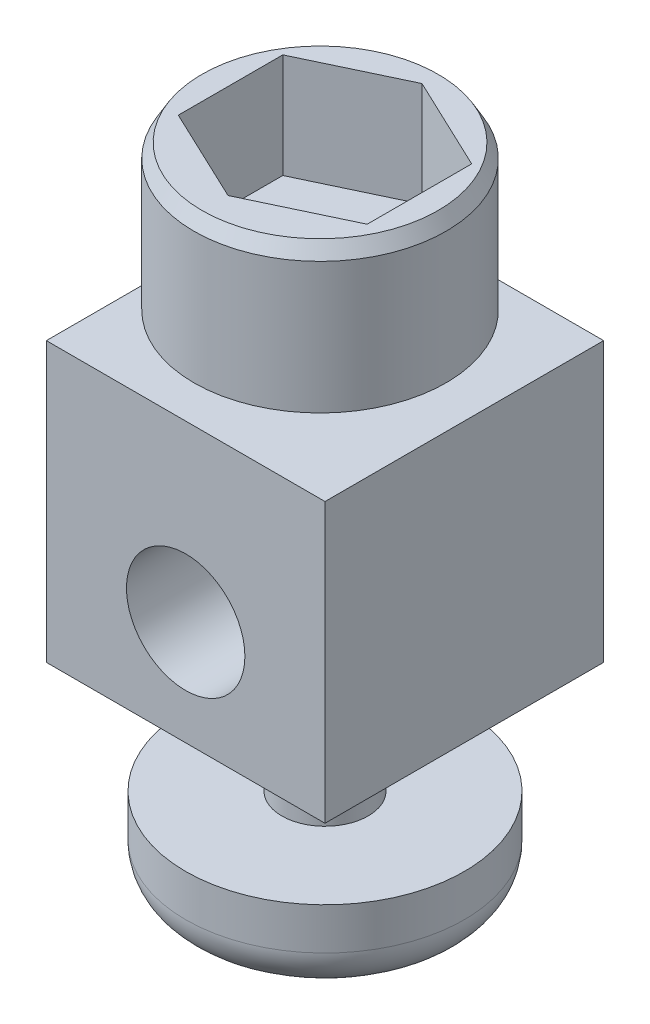
ISO-10303-21;
HEADER;
FILE_DESCRIPTION(('STEP AP214'),'2;1');
FILE_NAME('part.step','',(''),(''),'','','');
FILE_SCHEMA(('AUTOMOTIVE_DESIGN { 1 0 10303 214 1 1 1 1 }'));
ENDSEC;
DATA;
#1=APPLICATION_CONTEXT('core data for automotive mechanical design processes');
#2=APPLICATION_PROTOCOL_DEFINITION('international standard','automotive_design',2000,#1);
#3=PRODUCT_CONTEXT('',#1,'mechanical');
#4=PRODUCT('Part','Part','',(#3));
#5=PRODUCT_RELATED_PRODUCT_CATEGORY('part','',(#4));
#6=PRODUCT_DEFINITION_FORMATION('','',#4);
#7=PRODUCT_DEFINITION_CONTEXT('part definition',#1,'design');
#8=PRODUCT_DEFINITION('design','',#6,#7);
#9=PRODUCT_DEFINITION_SHAPE('','',#8);
#10=(LENGTH_UNIT() NAMED_UNIT(*) SI_UNIT(.MILLI.,.METRE.));
#11=(NAMED_UNIT(*) PLANE_ANGLE_UNIT() SI_UNIT($,.RADIAN.));
#12=(NAMED_UNIT(*) SI_UNIT($,.STERADIAN.) SOLID_ANGLE_UNIT());
#13=UNCERTAINTY_MEASURE_WITH_UNIT(LENGTH_MEASURE(1.E-05),#10,'distance_accuracy_value','');
#14=(GEOMETRIC_REPRESENTATION_CONTEXT(3) GLOBAL_UNCERTAINTY_ASSIGNED_CONTEXT((#13)) GLOBAL_UNIT_ASSIGNED_CONTEXT((#10,
#11,#12)) REPRESENTATION_CONTEXT('',''));
#15=CARTESIAN_POINT('',(0.,0.,0.));
#16=DIRECTION('',(0.,0.,1.));
#17=DIRECTION('',(1.,0.,0.));
#18=AXIS2_PLACEMENT_3D('',#15,#16,#17);
#19=CARTESIAN_POINT('',(0.,-6.5532,2.54));
#20=DIRECTION('',(0.,1.,0.));
#21=DIRECTION('',(-1.,0.,0.));
#22=AXIS2_PLACEMENT_3D('',#19,#20,#21);
#23=CYLINDRICAL_SURFACE('',#22,0.7874);
#24=CARTESIAN_POINT('',(0.,-4.57142455943335,2.54));
#25=DIRECTION('',(0.,1.,0.));
#26=DIRECTION('',(0.,0.,1.));
#27=AXIS2_PLACEMENT_3D('',#24,#25,#26);
#28=CIRCLE('',#27,0.7874);
#29=CARTESIAN_POINT('',(0.,-4.57142455943335,3.3274));
#30=VERTEX_POINT('',#29);
#31=EDGE_CURVE('E39',#30,#30,#28,.T.);
#32=ORIENTED_EDGE('',*,*,#31,.T.);
#33=EDGE_LOOP('',(#32));
#34=FACE_BOUND('',#33,.T.);
#35=CARTESIAN_POINT('',(0.,-2.54,2.54));
#36=DIRECTION('',(0.,1.,0.));
#37=DIRECTION('',(-1.,0.,0.));
#38=AXIS2_PLACEMENT_3D('',#35,#36,#37);
#39=CIRCLE('',#38,0.7874);
#40=CARTESIAN_POINT('',(-0.7874,-2.54,2.54));
#41=VERTEX_POINT('',#40);
#42=EDGE_CURVE('E183',#41,#41,#39,.F.);
#43=ORIENTED_EDGE('',*,*,#42,.T.);
#44=EDGE_LOOP('',(#43));
#45=FACE_BOUND('',#44,.T.);
#46=ADVANCED_FACE('F35',(#34,#45),#23,.T.);
#47=CARTESIAN_POINT('',(0.,5.715,2.63019473081329));
#48=DIRECTION('',(0.,1.,0.));
#49=DIRECTION('',(0.,0.,1.));
#50=AXIS2_PLACEMENT_3D('',#47,#48,#49);
#51=PLANE('',#50);
#52=CARTESIAN_POINT('',(0.,5.715,2.63019473081329));
#53=DIRECTION('',(0.,1.,0.));
#54=DIRECTION('',(0.,0.,1.));
#55=AXIS2_PLACEMENT_3D('',#52,#53,#54);
#56=CIRCLE('',#55,2.15205303162583);
#57=CARTESIAN_POINT('',(0.,5.715,4.78224776243912));
#58=VERTEX_POINT('',#57);
#59=EDGE_CURVE('E192',#58,#58,#56,.T.);
#60=ORIENTED_EDGE('',*,*,#59,.T.);
#61=EDGE_LOOP('',(#60));
#62=FACE_BOUND('',#61,.T.);
#63=DIRECTION('',(-0.00014525916845939,0.,0.999999989449887));
#64=VECTOR('',#63,1.);
#65=CARTESIAN_POINT('',(-1.72148007027149,5.715,1.58779210005618));
#66=LINE('',#65,#64);
#67=CARTESIAN_POINT('',(-1.72148007027149,5.715,1.58779210005618));
#68=VERTEX_POINT('',#67);
#69=CARTESIAN_POINT('',(-1.7217567889874,5.715,3.49279207995818));
#70=VERTEX_POINT('',#69);
#71=EDGE_CURVE('E140',#68,#70,#66,.T.);
#72=ORIENTED_EDGE('',*,*,#71,.F.);
#73=DIRECTION('',(0.90366407888267,0.,-0.428242025655045));
#74=VECTOR('',#73,1.);
#75=CARTESIAN_POINT('',(-1.72148007027149,5.715,1.58779210005618));
#76=LINE('',#75,#74);
#77=CARTESIAN_POINT('',(0.,5.715,0.771991041183319));
#78=VERTEX_POINT('',#77);
#79=EDGE_CURVE('E52',#68,#78,#76,.T.);
#80=ORIENTED_EDGE('',*,*,#79,.T.);
#81=DIRECTION('',(0.903736726890933,0.,0.428088692292221));
#82=VECTOR('',#81,1.);
#83=CARTESIAN_POINT('',(0.,5.715,0.771991041183319));
#84=LINE('',#83,#82);
#85=CARTESIAN_POINT('',(1.72161846472723,5.715,1.5875));
#86=VERTEX_POINT('',#85);
#87=EDGE_CURVE('E144',#78,#86,#84,.T.);
#88=ORIENTED_EDGE('',*,*,#87,.T.);
#89=DIRECTION('',(0.,0.,1.));
#90=VECTOR('',#89,1.);
#91=CARTESIAN_POINT('',(1.72161846472723,5.715,1.5875));
#92=LINE('',#91,#90);
#93=CARTESIAN_POINT('',(1.72161846472723,5.715,3.4925));
#94=VERTEX_POINT('',#93);
#95=EDGE_CURVE('E225',#86,#94,#92,.T.);
#96=ORIENTED_EDGE('',*,*,#95,.T.);
#97=DIRECTION('',(0.903736726890933,0.,-0.428088692292221));
#98=VECTOR('',#97,1.);
#99=CARTESIAN_POINT('',(0.,5.715,4.30800895881668));
#100=LINE('',#99,#98);
#101=CARTESIAN_POINT('',(0.,5.715,4.30800895881668));
#102=VERTEX_POINT('',#101);
#103=EDGE_CURVE('E228',#102,#94,#100,.T.);
#104=ORIENTED_EDGE('',*,*,#103,.F.);
#105=DIRECTION('',(0.903809338051129,0.,0.427935369479527));
#106=VECTOR('',#105,1.);
#107=CARTESIAN_POINT('',(-1.7217567889874,5.715,3.49279207995818));
#108=LINE('',#107,#106);
#109=EDGE_CURVE('E231',#70,#102,#108,.T.);
#110=ORIENTED_EDGE('',*,*,#109,.F.);
#111=EDGE_LOOP('',(#72,#80,#88,#96,#104,#110));
#112=FACE_BOUND('',#111,.T.);
#113=ADVANCED_FACE('F251',(#62,#112),#51,.T.);
#114=CARTESIAN_POINT('',(0.,5.715,2.63019473081329));
#115=DIRECTION('',(0.,-1.,0.));
#116=DIRECTION('',(0.,0.,-1.));
#117=AXIS2_PLACEMENT_3D('',#114,#115,#116);
#118=CYLINDRICAL_SURFACE('',#117,1.3716);
#119=CARTESIAN_POINT('',(0.,2.54,2.63019473081329));
#120=DIRECTION('',(0.,-1.,0.));
#121=DIRECTION('',(0.,0.,-1.));
#122=AXIS2_PLACEMENT_3D('',#119,#120,#121);
#123=CIRCLE('',#122,1.3716);
#124=CARTESIAN_POINT('',(0.,2.54,1.25859473081329));
#125=VERTEX_POINT('',#124);
#126=EDGE_CURVE('E186',#125,#125,#123,.F.);
#127=ORIENTED_EDGE('',*,*,#126,.T.);
#128=EDGE_LOOP('',(#127));
#129=FACE_BOUND('',#128,.T.);
#130=CARTESIAN_POINT('',(0.,2.921,2.63019473081329));
#131=DIRECTION('',(0.,1.,0.));
#132=DIRECTION('',(0.,0.,1.));
#133=AXIS2_PLACEMENT_3D('',#130,#131,#132);
#134=CIRCLE('',#133,1.3716);
#135=CARTESIAN_POINT('',(0.,2.921,4.00179473081329));
#136=VERTEX_POINT('',#135);
#137=EDGE_CURVE('E189',#136,#136,#134,.T.);
#138=ORIENTED_EDGE('',*,*,#137,.F.);
#139=EDGE_LOOP('',(#138));
#140=FACE_BOUND('',#139,.T.);
#141=ADVANCED_FACE('F272',(#129,#140),#118,.T.);
#142=CARTESIAN_POINT('',(2.54,2.54,5.08));
#143=DIRECTION('',(0.,-1.,0.));
#144=DIRECTION('',(0.,0.,-1.));
#145=AXIS2_PLACEMENT_3D('',#142,#143,#144);
#146=PLANE('',#145);
#147=DIRECTION('',(-1.,0.,0.));
#148=VECTOR('',#147,1.);
#149=CARTESIAN_POINT('',(2.54,2.54,0.));
#150=LINE('',#149,#148);
#151=CARTESIAN_POINT('',(2.54,2.54,0.));
#152=VERTEX_POINT('',#151);
#153=CARTESIAN_POINT('',(-2.54,2.54,0.));
#154=VERTEX_POINT('',#153);
#155=EDGE_CURVE('E172',#152,#154,#150,.T.);
#156=ORIENTED_EDGE('',*,*,#155,.T.);
#157=DIRECTION('',(0.,0.,-1.));
#158=VECTOR('',#157,1.);
#159=CARTESIAN_POINT('',(-2.54,2.54,5.08));
#160=LINE('',#159,#158);
#161=CARTESIAN_POINT('',(-2.54,2.54,5.08));
#162=VERTEX_POINT('',#161);
#163=EDGE_CURVE('E176',#162,#154,#160,.T.);
#164=ORIENTED_EDGE('',*,*,#163,.F.);
#165=DIRECTION('',(-1.,0.,0.));
#166=VECTOR('',#165,1.);
#167=CARTESIAN_POINT('',(2.54,2.54,5.08));
#168=LINE('',#167,#166);
#169=CARTESIAN_POINT('',(2.54,2.54,5.08));
#170=VERTEX_POINT('',#169);
#171=EDGE_CURVE('E164',#170,#162,#168,.T.);
#172=ORIENTED_EDGE('',*,*,#171,.F.);
#173=DIRECTION('',(0.,0.,-1.));
#174=VECTOR('',#173,1.);
#175=CARTESIAN_POINT('',(2.54,2.54,5.08));
#176=LINE('',#175,#174);
#177=EDGE_CURVE('E178',#170,#152,#176,.T.);
#178=ORIENTED_EDGE('',*,*,#177,.T.);
#179=EDGE_LOOP('',(#156,#164,#172,#178));
#180=FACE_BOUND('',#179,.T.);
#181=ORIENTED_EDGE('',*,*,#126,.F.);
#182=EDGE_LOOP('',(#181));
#183=FACE_BOUND('',#182,.T.);
#184=ADVANCED_FACE('F295',(#180,#183),#146,.F.);
#185=CARTESIAN_POINT('',(-2.54,-2.54,5.08));
#186=DIRECTION('',(0.,1.,0.));
#187=DIRECTION('',(-1.,0.,0.));
#188=AXIS2_PLACEMENT_3D('',#185,#186,#187);
#189=PLANE('',#188);
#190=DIRECTION('',(1.,0.,0.));
#191=VECTOR('',#190,1.);
#192=CARTESIAN_POINT('',(-2.54,-2.54,0.));
#193=LINE('',#192,#191);
#194=CARTESIAN_POINT('',(-2.54,-2.54,0.));
#195=VERTEX_POINT('',#194);
#196=CARTESIAN_POINT('',(2.54,-2.54,0.));
#197=VERTEX_POINT('',#196);
#198=EDGE_CURVE('E158',#195,#197,#193,.T.);
#199=ORIENTED_EDGE('',*,*,#198,.T.);
#200=DIRECTION('',(0.,0.,-1.));
#201=VECTOR('',#200,1.);
#202=CARTESIAN_POINT('',(2.54,-2.54,5.08));
#203=LINE('',#202,#201);
#204=CARTESIAN_POINT('',(2.54,-2.54,5.08));
#205=VERTEX_POINT('',#204);
#206=EDGE_CURVE('E181',#205,#197,#203,.T.);
#207=ORIENTED_EDGE('',*,*,#206,.F.);
#208=DIRECTION('',(1.,0.,0.));
#209=VECTOR('',#208,1.);
#210=CARTESIAN_POINT('',(-2.54,-2.54,5.08));
#211=LINE('',#210,#209);
#212=CARTESIAN_POINT('',(-2.54,-2.54,5.08));
#213=VERTEX_POINT('',#212);
#214=EDGE_CURVE('E161',#213,#205,#211,.T.);
#215=ORIENTED_EDGE('',*,*,#214,.F.);
#216=DIRECTION('',(0.,0.,-1.));
#217=VECTOR('',#216,1.);
#218=CARTESIAN_POINT('',(-2.54,-2.54,5.08));
#219=LINE('',#218,#217);
#220=EDGE_CURVE('E167',#213,#195,#219,.T.);
#221=ORIENTED_EDGE('',*,*,#220,.T.);
#222=EDGE_LOOP('',(#199,#207,#215,#221));
#223=FACE_BOUND('',#222,.T.);
#224=ORIENTED_EDGE('',*,*,#42,.F.);
#225=EDGE_LOOP('',(#224));
#226=FACE_BOUND('',#225,.T.);
#227=ADVANCED_FACE('F471',(#223,#226),#189,.F.);
#228=CARTESIAN_POINT('',(2.54,-2.54,5.08));
#229=DIRECTION('',(-1.,0.,0.));
#230=DIRECTION('',(0.,-1.,0.));
#231=AXIS2_PLACEMENT_3D('',#228,#229,#230);
#232=PLANE('',#231);
#233=DIRECTION('',(0.,1.,0.));
#234=VECTOR('',#233,1.);
#235=CARTESIAN_POINT('',(2.54,-2.54,0.));
#236=LINE('',#235,#234);
#237=EDGE_CURVE('E170',#197,#152,#236,.T.);
#238=ORIENTED_EDGE('',*,*,#237,.T.);
#239=ORIENTED_EDGE('',*,*,#177,.F.);
#240=DIRECTION('',(0.,1.,0.));
#241=VECTOR('',#240,1.);
#242=CARTESIAN_POINT('',(2.54,-2.54,5.08));
#243=LINE('',#242,#241);
#244=EDGE_CURVE('E90',#205,#170,#243,.T.);
#245=ORIENTED_EDGE('',*,*,#244,.F.);
#246=ORIENTED_EDGE('',*,*,#206,.T.);
#247=EDGE_LOOP('',(#238,#239,#245,#246));
#248=FACE_BOUND('',#247,.T.);
#249=ADVANCED_FACE('F486',(#248),#232,.F.);
#250=CARTESIAN_POINT('',(-2.54,2.54,5.08));
#251=DIRECTION('',(1.,0.,0.));
#252=DIRECTION('',(0.,1.,0.));
#253=AXIS2_PLACEMENT_3D('',#250,#251,#252);
#254=PLANE('',#253);
#255=DIRECTION('',(0.,-1.,0.));
#256=VECTOR('',#255,1.);
#257=CARTESIAN_POINT('',(-2.54,2.54,0.));
#258=LINE('',#257,#256);
#259=EDGE_CURVE('E82',#154,#195,#258,.T.);
#260=ORIENTED_EDGE('',*,*,#259,.T.);
#261=ORIENTED_EDGE('',*,*,#220,.F.);
#262=DIRECTION('',(0.,-1.,0.));
#263=VECTOR('',#262,1.);
#264=CARTESIAN_POINT('',(-2.54,2.54,5.08));
#265=LINE('',#264,#263);
#266=EDGE_CURVE('E61',#162,#213,#265,.T.);
#267=ORIENTED_EDGE('',*,*,#266,.F.);
#268=ORIENTED_EDGE('',*,*,#163,.T.);
#269=EDGE_LOOP('',(#260,#261,#267,#268));
#270=FACE_BOUND('',#269,.T.);
#271=ADVANCED_FACE('F518',(#270),#254,.F.);
#272=CARTESIAN_POINT('',(-2.54,-2.54,5.08));
#273=DIRECTION('',(0.,0.,-1.));
#274=DIRECTION('',(-1.,0.,0.));
#275=AXIS2_PLACEMENT_3D('',#272,#273,#274);
#276=PLANE('',#275);
#277=CARTESIAN_POINT('',(0.,-0.635,5.08));
#278=DIRECTION('',(0.,0.,1.));
#279=DIRECTION('',(1.,0.,0.));
#280=AXIS2_PLACEMENT_3D('',#277,#278,#279);
#281=CIRCLE('',#280,1.0795);
#282=CARTESIAN_POINT('',(1.0795,-0.635,5.08));
#283=VERTEX_POINT('',#282);
#284=EDGE_CURVE('E149',#283,#283,#281,.T.);
#285=ORIENTED_EDGE('',*,*,#284,.F.);
#286=EDGE_LOOP('',(#285));
#287=FACE_BOUND('',#286,.T.);
#288=ORIENTED_EDGE('',*,*,#214,.T.);
#289=ORIENTED_EDGE('',*,*,#244,.T.);
#290=ORIENTED_EDGE('',*,*,#171,.T.);
#291=ORIENTED_EDGE('',*,*,#266,.T.);
#292=EDGE_LOOP('',(#288,#289,#290,#291));
#293=FACE_BOUND('',#292,.T.);
#294=ADVANCED_FACE('F508',(#287,#293),#276,.F.);
#295=CARTESIAN_POINT('',(-2.54,-2.54,0.));
#296=DIRECTION('',(0.,0.,-1.));
#297=DIRECTION('',(-1.,0.,0.));
#298=AXIS2_PLACEMENT_3D('',#295,#296,#297);
#299=PLANE('',#298);
#300=CARTESIAN_POINT('',(0.,-0.635,0.));
#301=DIRECTION('',(0.,0.,1.));
#302=DIRECTION('',(1.,0.,0.));
#303=AXIS2_PLACEMENT_3D('',#300,#301,#302);
#304=CIRCLE('',#303,1.0795);
#305=CARTESIAN_POINT('',(1.0795,-0.635,0.));
#306=VERTEX_POINT('',#305);
#307=EDGE_CURVE('E155',#306,#306,#304,.T.);
#308=ORIENTED_EDGE('',*,*,#307,.T.);
#309=EDGE_LOOP('',(#308));
#310=FACE_BOUND('',#309,.T.);
#311=ORIENTED_EDGE('',*,*,#198,.F.);
#312=ORIENTED_EDGE('',*,*,#259,.F.);
#313=ORIENTED_EDGE('',*,*,#155,.F.);
#314=ORIENTED_EDGE('',*,*,#237,.F.);
#315=EDGE_LOOP('',(#311,#312,#313,#314));
#316=FACE_BOUND('',#315,.T.);
#317=ADVANCED_FACE('F497',(#310,#316),#299,.T.);
#318=CARTESIAN_POINT('',(0.,-0.635,0.));
#319=DIRECTION('',(0.,0.,1.));
#320=DIRECTION('',(1.,0.,0.));
#321=AXIS2_PLACEMENT_3D('',#318,#319,#320);
#322=CYLINDRICAL_SURFACE('',#321,1.0795);
#323=ORIENTED_EDGE('',*,*,#307,.F.);
#324=EDGE_LOOP('',(#323));
#325=FACE_BOUND('',#324,.T.);
#326=ORIENTED_EDGE('',*,*,#284,.T.);
#327=EDGE_LOOP('',(#326));
#328=FACE_BOUND('',#327,.T.);
#329=ADVANCED_FACE('F306',(#325,#328),#322,.F.);
#330=CARTESIAN_POINT('',(0.,2.921,2.63019473081329));
#331=DIRECTION('',(0.,1.,0.));
#332=DIRECTION('',(0.,0.,1.));
#333=AXIS2_PLACEMENT_3D('',#330,#331,#332);
#334=PLANE('',#333);
#335=CARTESIAN_POINT('',(0.,2.921,2.63019473081329));
#336=DIRECTION('',(0.,1.,0.));
#337=DIRECTION('',(0.,0.,1.));
#338=AXIS2_PLACEMENT_3D('',#335,#336,#337);
#339=CIRCLE('',#338,2.0447);
#340=CARTESIAN_POINT('',(0.,2.921,4.67489473081328));
#341=VERTEX_POINT('',#340);
#342=EDGE_CURVE('E11',#341,#341,#339,.F.);
#343=ORIENTED_EDGE('',*,*,#342,.T.);
#344=EDGE_LOOP('',(#343));
#345=FACE_BOUND('',#344,.T.);
#346=ORIENTED_EDGE('',*,*,#137,.T.);
#347=EDGE_LOOP('',(#346));
#348=FACE_BOUND('',#347,.T.);
#349=ADVANCED_FACE('F302',(#345,#348),#334,.F.);
#350=CARTESIAN_POINT('',(0.,2.921,2.63019473081329));
#351=DIRECTION('',(0.,1.,0.));
#352=DIRECTION('',(0.,0.,1.));
#353=AXIS2_PLACEMENT_3D('',#350,#351,#352);
#354=CYLINDRICAL_SURFACE('',#353,2.2987);
#355=CARTESIAN_POINT('',(0.,3.06764696837417,2.63019473081329));
#356=DIRECTION('',(0.,1.,0.));
#357=DIRECTION('',(0.,0.,1.));
#358=AXIS2_PLACEMENT_3D('',#355,#356,#357);
#359=CIRCLE('',#358,2.2987);
#360=CARTESIAN_POINT('',(0.,3.06764696837417,4.92889473081329));
#361=VERTEX_POINT('',#360);
#362=EDGE_CURVE('E44',#361,#361,#359,.T.);
#363=ORIENTED_EDGE('',*,*,#362,.T.);
#364=EDGE_LOOP('',(#363));
#365=FACE_BOUND('',#364,.T.);
#366=CARTESIAN_POINT('',(0.,5.461,2.63019473081329));
#367=DIRECTION('',(0.,1.,0.));
#368=DIRECTION('',(0.,0.,1.));
#369=AXIS2_PLACEMENT_3D('',#366,#367,#368);
#370=CIRCLE('',#369,2.2987);
#371=CARTESIAN_POINT('',(0.,5.461,4.92889473081329));
#372=VERTEX_POINT('',#371);
#373=EDGE_CURVE('E195',#372,#372,#370,.F.);
#374=ORIENTED_EDGE('',*,*,#373,.T.);
#375=EDGE_LOOP('',(#374));
#376=FACE_BOUND('',#375,.T.);
#377=ADVANCED_FACE('F298',(#365,#376),#354,.T.);
#378=CARTESIAN_POINT('',(0.,5.715,2.63019473081329));
#379=DIRECTION('',(0.,-1.,0.));
#380=DIRECTION('',(0.,0.,-1.));
#381=AXIS2_PLACEMENT_3D('',#378,#379,#380);
#382=CONICAL_SURFACE('',#381,2.15205303162583,0.523598775598296);
#383=ORIENTED_EDGE('',*,*,#373,.F.);
#384=EDGE_LOOP('',(#383));
#385=FACE_BOUND('',#384,.T.);
#386=ORIENTED_EDGE('',*,*,#59,.F.);
#387=EDGE_LOOP('',(#386));
#388=FACE_BOUND('',#387,.T.);
#389=ADVANCED_FACE('F301',(#385,#388),#382,.T.);
#390=CARTESIAN_POINT('',(-1.72148007027149,3.81,1.58779210005618));
#391=DIRECTION('',(0.428242025655045,0.,0.90366407888267));
#392=DIRECTION('',(0.90366407888267,0.,-0.428242025655045));
#393=AXIS2_PLACEMENT_3D('',#390,#391,#392);
#394=PLANE('',#393);
#395=ORIENTED_EDGE('',*,*,#79,.F.);
#396=DIRECTION('',(0.,1.,0.));
#397=VECTOR('',#396,1.);
#398=CARTESIAN_POINT('',(-1.72148007027149,3.81,1.58779210005618));
#399=LINE('',#398,#397);
#400=CARTESIAN_POINT('',(-1.72148007027149,3.81,1.58779210005618));
#401=VERTEX_POINT('',#400);
#402=EDGE_CURVE('E139',#401,#68,#399,.T.);
#403=ORIENTED_EDGE('',*,*,#402,.F.);
#404=DIRECTION('',(0.90366407888267,0.,-0.428242025655045));
#405=VECTOR('',#404,1.);
#406=CARTESIAN_POINT('',(-1.72148007027149,3.81,1.58779210005618));
#407=LINE('',#406,#405);
#408=CARTESIAN_POINT('',(0.,3.81,0.771991041183319));
#409=VERTEX_POINT('',#408);
#410=EDGE_CURVE('E129',#401,#409,#407,.T.);
#411=ORIENTED_EDGE('',*,*,#410,.T.);
#412=DIRECTION('',(0.,1.,0.));
#413=VECTOR('',#412,1.);
#414=CARTESIAN_POINT('',(0.,3.81,0.771991041183319));
#415=LINE('',#414,#413);
#416=EDGE_CURVE('E138',#409,#78,#415,.T.);
#417=ORIENTED_EDGE('',*,*,#416,.T.);
#418=EDGE_LOOP('',(#395,#403,#411,#417));
#419=FACE_BOUND('',#418,.T.);
#420=ADVANCED_FACE('F137',(#419),#394,.T.);
#421=CARTESIAN_POINT('',(0.,3.81,0.771991041183319));
#422=DIRECTION('',(-0.428088692292221,0.,0.903736726890933));
#423=DIRECTION('',(0.903736726890933,0.,0.428088692292221));
#424=AXIS2_PLACEMENT_3D('',#421,#422,#423);
#425=PLANE('',#424);
#426=ORIENTED_EDGE('',*,*,#87,.F.);
#427=ORIENTED_EDGE('',*,*,#416,.F.);
#428=DIRECTION('',(0.903736726890933,0.,0.428088692292221));
#429=VECTOR('',#428,1.);
#430=CARTESIAN_POINT('',(0.,3.81,0.771991041183319));
#431=LINE('',#430,#429);
#432=CARTESIAN_POINT('',(1.72161846472723,3.81,1.5875));
#433=VERTEX_POINT('',#432);
#434=EDGE_CURVE('E125',#409,#433,#431,.T.);
#435=ORIENTED_EDGE('',*,*,#434,.T.);
#436=DIRECTION('',(0.,1.,0.));
#437=VECTOR('',#436,1.);
#438=CARTESIAN_POINT('',(1.72161846472723,3.81,1.5875));
#439=LINE('',#438,#437);
#440=EDGE_CURVE('E146',#433,#86,#439,.T.);
#441=ORIENTED_EDGE('',*,*,#440,.T.);
#442=EDGE_LOOP('',(#426,#427,#435,#441));
#443=FACE_BOUND('',#442,.T.);
#444=ADVANCED_FACE('F142',(#443),#425,.T.);
#445=CARTESIAN_POINT('',(1.72161846472723,3.81,1.5875));
#446=DIRECTION('',(-1.,0.,0.));
#447=DIRECTION('',(0.,0.,1.));
#448=AXIS2_PLACEMENT_3D('',#445,#446,#447);
#449=PLANE('',#448);
#450=ORIENTED_EDGE('',*,*,#95,.F.);
#451=ORIENTED_EDGE('',*,*,#440,.F.);
#452=DIRECTION('',(0.,0.,1.));
#453=VECTOR('',#452,1.);
#454=CARTESIAN_POINT('',(1.72161846472723,3.81,1.5875));
#455=LINE('',#454,#453);
#456=CARTESIAN_POINT('',(1.72161846472723,3.81,3.4925));
#457=VERTEX_POINT('',#456);
#458=EDGE_CURVE('E132',#433,#457,#455,.T.);
#459=ORIENTED_EDGE('',*,*,#458,.T.);
#460=DIRECTION('',(0.,1.,0.));
#461=VECTOR('',#460,1.);
#462=CARTESIAN_POINT('',(1.72161846472723,3.81,3.4925));
#463=LINE('',#462,#461);
#464=EDGE_CURVE('E151',#457,#94,#463,.T.);
#465=ORIENTED_EDGE('',*,*,#464,.T.);
#466=EDGE_LOOP('',(#450,#451,#459,#465));
#467=FACE_BOUND('',#466,.T.);
#468=ADVANCED_FACE('F243',(#467),#449,.T.);
#469=CARTESIAN_POINT('',(0.,3.81,4.30800895881668));
#470=DIRECTION('',(0.428088692292221,0.,0.903736726890933));
#471=DIRECTION('',(0.903736726890933,0.,-0.428088692292221));
#472=AXIS2_PLACEMENT_3D('',#469,#470,#471);
#473=PLANE('',#472);
#474=ORIENTED_EDGE('',*,*,#103,.T.);
#475=ORIENTED_EDGE('',*,*,#464,.F.);
#476=DIRECTION('',(0.903736726890933,0.,-0.428088692292221));
#477=VECTOR('',#476,1.);
#478=CARTESIAN_POINT('',(0.,3.81,4.30800895881668));
#479=LINE('',#478,#477);
#480=CARTESIAN_POINT('',(0.,3.81,4.30800895881668));
#481=VERTEX_POINT('',#480);
#482=EDGE_CURVE('E216',#481,#457,#479,.T.);
#483=ORIENTED_EDGE('',*,*,#482,.F.);
#484=DIRECTION('',(0.,1.,0.));
#485=VECTOR('',#484,1.);
#486=CARTESIAN_POINT('',(0.,3.81,4.30800895881668));
#487=LINE('',#486,#485);
#488=EDGE_CURVE('E239',#481,#102,#487,.T.);
#489=ORIENTED_EDGE('',*,*,#488,.T.);
#490=EDGE_LOOP('',(#474,#475,#483,#489));
#491=FACE_BOUND('',#490,.T.);
#492=ADVANCED_FACE('F247',(#491),#473,.F.);
#493=CARTESIAN_POINT('',(-1.7217567889874,3.81,3.49279207995818));
#494=DIRECTION('',(-0.427935369479527,0.,0.903809338051129));
#495=DIRECTION('',(0.903809338051129,0.,0.427935369479527));
#496=AXIS2_PLACEMENT_3D('',#493,#494,#495);
#497=PLANE('',#496);
#498=ORIENTED_EDGE('',*,*,#109,.T.);
#499=ORIENTED_EDGE('',*,*,#488,.F.);
#500=DIRECTION('',(0.903809338051129,0.,0.427935369479527));
#501=VECTOR('',#500,1.);
#502=CARTESIAN_POINT('',(-1.7217567889874,3.81,3.49279207995818));
#503=LINE('',#502,#501);
#504=CARTESIAN_POINT('',(-1.7217567889874,3.81,3.49279207995818));
#505=VERTEX_POINT('',#504);
#506=EDGE_CURVE('E218',#505,#481,#503,.T.);
#507=ORIENTED_EDGE('',*,*,#506,.F.);
#508=DIRECTION('',(0.,1.,0.));
#509=VECTOR('',#508,1.);
#510=CARTESIAN_POINT('',(-1.7217567889874,3.81,3.49279207995818));
#511=LINE('',#510,#509);
#512=EDGE_CURVE('E237',#505,#70,#511,.T.);
#513=ORIENTED_EDGE('',*,*,#512,.T.);
#514=EDGE_LOOP('',(#498,#499,#507,#513));
#515=FACE_BOUND('',#514,.T.);
#516=ADVANCED_FACE('F256',(#515),#497,.F.);
#517=CARTESIAN_POINT('',(-1.72148007027149,3.81,1.58779210005618));
#518=DIRECTION('',(-0.999999989449887,0.,-0.00014525916845939));
#519=DIRECTION('',(-0.00014525916845939,0.,0.999999989449887));
#520=AXIS2_PLACEMENT_3D('',#517,#518,#519);
#521=PLANE('',#520);
#522=ORIENTED_EDGE('',*,*,#71,.T.);
#523=ORIENTED_EDGE('',*,*,#512,.F.);
#524=DIRECTION('',(-0.00014525916845939,0.,0.999999989449887));
#525=VECTOR('',#524,1.);
#526=CARTESIAN_POINT('',(-1.72148007027149,3.81,1.58779210005618));
#527=LINE('',#526,#525);
#528=EDGE_CURVE('E221',#401,#505,#527,.T.);
#529=ORIENTED_EDGE('',*,*,#528,.F.);
#530=ORIENTED_EDGE('',*,*,#402,.T.);
#531=EDGE_LOOP('',(#522,#523,#529,#530));
#532=FACE_BOUND('',#531,.T.);
#533=ADVANCED_FACE('F253',(#532),#521,.F.);
#534=CARTESIAN_POINT('',(1.72161846472723,3.81,-0.0438756021511246));
#535=DIRECTION('',(0.,-1.,0.));
#536=DIRECTION('',(0.,0.,-1.));
#537=AXIS2_PLACEMENT_3D('',#534,#535,#536);
#538=PLANE('',#537);
#539=ORIENTED_EDGE('',*,*,#410,.F.);
#540=ORIENTED_EDGE('',*,*,#528,.T.);
#541=ORIENTED_EDGE('',*,*,#506,.T.);
#542=ORIENTED_EDGE('',*,*,#482,.T.);
#543=ORIENTED_EDGE('',*,*,#458,.F.);
#544=ORIENTED_EDGE('',*,*,#434,.F.);
#545=EDGE_LOOP('',(#539,#540,#541,#542,#543,#544));
#546=FACE_BOUND('',#545,.T.);
#547=ADVANCED_FACE('F127',(#546),#538,.F.);
#548=CARTESIAN_POINT('',(0.,3.06764696837417,2.63019473081329));
#549=DIRECTION('',(0.,1.,0.));
#550=DIRECTION('',(0.,0.,1.));
#551=AXIS2_PLACEMENT_3D('',#548,#549,#550);
#552=CONICAL_SURFACE('',#551,2.2987,1.0471975511966);
#553=ORIENTED_EDGE('',*,*,#342,.F.);
#554=EDGE_LOOP('',(#553));
#555=FACE_BOUND('',#554,.T.);
#556=ORIENTED_EDGE('',*,*,#362,.F.);
#557=EDGE_LOOP('',(#556));
#558=FACE_BOUND('',#557,.T.);
#559=ADVANCED_FACE('F37',(#555,#558),#552,.T.);
#560=CARTESIAN_POINT('',(0.,-4.57142455943335,2.54));
#561=DIRECTION('',(0.,1.,0.));
#562=DIRECTION('',(0.,0.,1.));
#563=AXIS2_PLACEMENT_3D('',#560,#561,#562);
#564=PLANE('',#563);
#565=CARTESIAN_POINT('',(0.,-4.57142455943335,2.54));
#566=DIRECTION('',(0.,1.,0.));
#567=DIRECTION('',(0.,0.,1.));
#568=AXIS2_PLACEMENT_3D('',#565,#566,#567);
#569=CIRCLE('',#568,2.54);
#570=CARTESIAN_POINT('',(0.,-4.57142455943335,5.08));
#571=VERTEX_POINT('',#570);
#572=EDGE_CURVE('E201',#571,#571,#569,.T.);
#573=ORIENTED_EDGE('',*,*,#572,.T.);
#574=EDGE_LOOP('',(#573));
#575=FACE_BOUND('',#574,.T.);
#576=ORIENTED_EDGE('',*,*,#31,.F.);
#577=EDGE_LOOP('',(#576));
#578=FACE_BOUND('',#577,.T.);
#579=ADVANCED_FACE('F360',(#575,#578),#564,.T.);
#580=CARTESIAN_POINT('',(0.,-6.09542455943347,2.54));
#581=DIRECTION('',(0.,-1.,0.));
#582=DIRECTION('',(0.,0.,-1.));
#583=AXIS2_PLACEMENT_3D('',#580,#581,#582);
#584=PLANE('',#583);
#585=CARTESIAN_POINT('',(0.,-6.09542455943347,2.54));
#586=DIRECTION('',(0.,1.,0.));
#587=DIRECTION('',(0.,0.,1.));
#588=AXIS2_PLACEMENT_3D('',#585,#586,#587);
#589=CIRCLE('',#588,1.778);
#590=CARTESIAN_POINT('',(0.,-6.09542455943347,4.318));
#591=VERTEX_POINT('',#590);
#592=EDGE_CURVE('E211',#591,#591,#589,.T.);
#593=ORIENTED_EDGE('',*,*,#592,.F.);
#594=EDGE_LOOP('',(#593));
#595=FACE_BOUND('',#594,.T.);
#596=CARTESIAN_POINT('',(0.,-6.09542455943347,2.54));
#597=DIRECTION('',(0.,-1.,0.));
#598=DIRECTION('',(0.,0.,-1.));
#599=AXIS2_PLACEMENT_3D('',#596,#597,#598);
#600=CIRCLE('',#599,0.7874);
#601=CARTESIAN_POINT('',(0.,-6.09542455943347,1.7526));
#602=VERTEX_POINT('',#601);
#603=EDGE_CURVE('E199',#602,#602,#600,.T.);
#604=ORIENTED_EDGE('',*,*,#603,.F.);
#605=EDGE_LOOP('',(#604));
#606=FACE_BOUND('',#605,.T.);
#607=ADVANCED_FACE('F377',(#595,#606),#584,.T.);
#608=CARTESIAN_POINT('',(0.,-4.57142455943335,2.54));
#609=DIRECTION('',(0.,1.,0.));
#610=DIRECTION('',(0.,0.,1.));
#611=AXIS2_PLACEMENT_3D('',#608,#609,#610);
#612=CYLINDRICAL_SURFACE('',#611,2.54);
#613=CARTESIAN_POINT('',(0.,-5.33342455943347,2.54));
#614=DIRECTION('',(0.,1.,0.));
#615=DIRECTION('',(0.,0.,1.));
#616=AXIS2_PLACEMENT_3D('',#613,#614,#615);
#617=CIRCLE('',#616,2.54);
#618=CARTESIAN_POINT('',(0.,-5.33342455943347,5.08));
#619=VERTEX_POINT('',#618);
#620=EDGE_CURVE('E206',#619,#619,#617,.T.);
#621=ORIENTED_EDGE('',*,*,#620,.T.);
#622=EDGE_LOOP('',(#621));
#623=FACE_BOUND('',#622,.T.);
#624=ORIENTED_EDGE('',*,*,#572,.F.);
#625=EDGE_LOOP('',(#624));
#626=FACE_BOUND('',#625,.T.);
#627=ADVANCED_FACE('F290',(#623,#626),#612,.T.);
#628=CARTESIAN_POINT('',(0.,-5.33342455943347,2.54));
#629=DIRECTION('',(0.,1.,0.));
#630=DIRECTION('',(0.,0.,1.));
#631=AXIS2_PLACEMENT_3D('',#628,#629,#630);
#632=TOROIDAL_SURFACE('',#631,1.778,0.762);
#633=ORIENTED_EDGE('',*,*,#592,.T.);
#634=EDGE_LOOP('',(#633));
#635=FACE_BOUND('',#634,.T.);
#636=ORIENTED_EDGE('',*,*,#620,.F.);
#637=EDGE_LOOP('',(#636));
#638=FACE_BOUND('',#637,.T.);
#639=ADVANCED_FACE('F283',(#635,#638),#632,.T.);
#640=CARTESIAN_POINT('',(0.,-6.5532,2.54));
#641=DIRECTION('',(0.,-1.,0.));
#642=DIRECTION('',(1.,0.,0.));
#643=AXIS2_PLACEMENT_3D('',#640,#641,#642);
#644=PLANE('',#643);
#645=CARTESIAN_POINT('',(0.,-6.5532,2.54));
#646=DIRECTION('',(0.,-1.,0.));
#647=DIRECTION('',(1.,0.,0.));
#648=AXIS2_PLACEMENT_3D('',#645,#646,#647);
#649=CIRCLE('',#648,0.7874);
#650=CARTESIAN_POINT('',(0.787400000000001,-6.5532,2.54));
#651=VERTEX_POINT('',#650);
#652=EDGE_CURVE('E145',#651,#651,#649,.T.);
#653=ORIENTED_EDGE('',*,*,#652,.T.);
#654=EDGE_LOOP('',(#653));
#655=FACE_BOUND('',#654,.T.);
#656=ADVANCED_FACE('F279',(#655),#644,.T.);
#657=ORIENTED_EDGE('',*,*,#603,.T.);
#658=EDGE_LOOP('',(#657));
#659=FACE_BOUND('',#658,.T.);
#660=ORIENTED_EDGE('',*,*,#652,.F.);
#661=EDGE_LOOP('',(#660));
#662=FACE_BOUND('',#661,.T.);
#663=ADVANCED_FACE('F268',(#659,#662),#23,.T.);
#664=CLOSED_SHELL('',(#46,#113,#141,#184,#227,#249,#271,#294,#317,#329,#349,#377,#389,#420,#444,
#468,#492,#516,#533,#547,#559,#579,#607,#627,#639,#656,#663));
#665=MANIFOLD_SOLID_BREP('B2',#664);
#666=ADVANCED_BREP_SHAPE_REPRESENTATION('',(#18,#665),#14);
#667=SHAPE_DEFINITION_REPRESENTATION(#9,#666);
ENDSEC;
END-ISO-10303-21;
